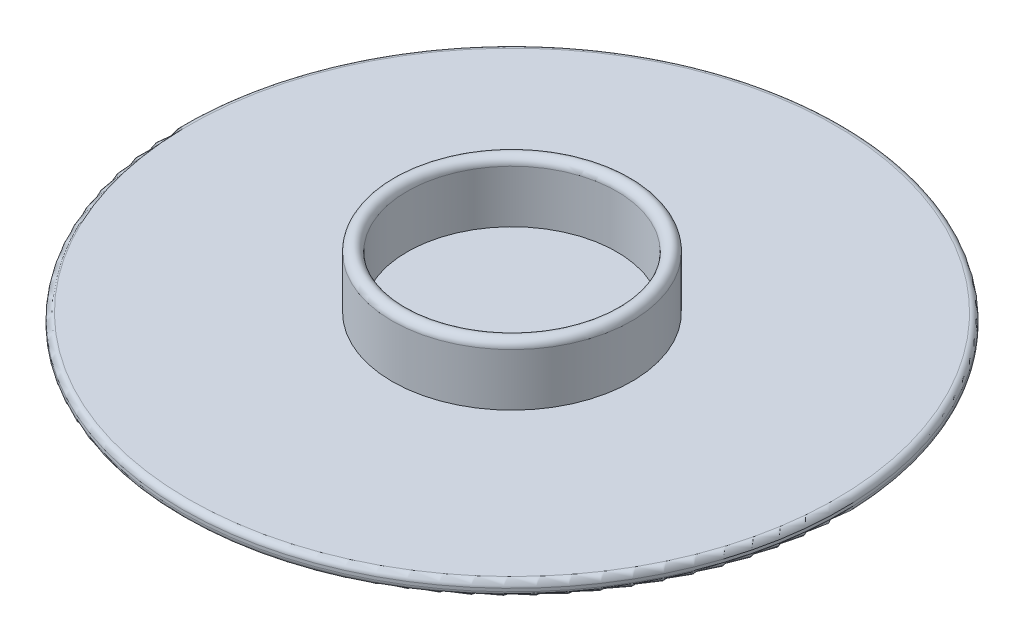
ISO-10303-21;
HEADER;
FILE_DESCRIPTION(('STEP AP214'),'2;1');
FILE_NAME('part.step','',(''),(''),'','','');
FILE_SCHEMA(('AUTOMOTIVE_DESIGN { 1 0 10303 214 1 1 1 1 }'));
ENDSEC;
DATA;
#1=APPLICATION_CONTEXT('core data for automotive mechanical design processes');
#2=APPLICATION_PROTOCOL_DEFINITION('international standard','automotive_design',2000,#1);
#3=PRODUCT_CONTEXT('',#1,'mechanical');
#4=PRODUCT('Part','Part','',(#3));
#5=PRODUCT_RELATED_PRODUCT_CATEGORY('part','',(#4));
#6=PRODUCT_DEFINITION_FORMATION('','',#4);
#7=PRODUCT_DEFINITION_CONTEXT('part definition',#1,'design');
#8=PRODUCT_DEFINITION('design','',#6,#7);
#9=PRODUCT_DEFINITION_SHAPE('','',#8);
#10=(LENGTH_UNIT() NAMED_UNIT(*) SI_UNIT(.MILLI.,.METRE.));
#11=(NAMED_UNIT(*) PLANE_ANGLE_UNIT() SI_UNIT($,.RADIAN.));
#12=(NAMED_UNIT(*) SI_UNIT($,.STERADIAN.) SOLID_ANGLE_UNIT());
#13=UNCERTAINTY_MEASURE_WITH_UNIT(LENGTH_MEASURE(1.E-05),#10,'distance_accuracy_value','');
#14=(GEOMETRIC_REPRESENTATION_CONTEXT(3) GLOBAL_UNCERTAINTY_ASSIGNED_CONTEXT((#13)) GLOBAL_UNIT_ASSIGNED_CONTEXT((#10,
#11,#12)) REPRESENTATION_CONTEXT('',''));
#15=CARTESIAN_POINT('',(0.,0.,0.));
#16=DIRECTION('',(0.,0.,1.));
#17=DIRECTION('',(1.,0.,0.));
#18=AXIS2_PLACEMENT_3D('',#15,#16,#17);
#19=CARTESIAN_POINT('',(0.,2.25,0.));
#20=DIRECTION('',(0.,1.,0.));
#21=DIRECTION('',(0.,0.,1.));
#22=AXIS2_PLACEMENT_3D('',#19,#20,#21);
#23=TOROIDAL_SURFACE('',#22,3.75,0.25);
#24=CARTESIAN_POINT('',(0.,2.25,0.));
#25=DIRECTION('',(0.,1.,0.));
#26=DIRECTION('',(0.,0.,1.));
#27=AXIS2_PLACEMENT_3D('',#24,#25,#26);
#28=CIRCLE('',#27,4.);
#29=CARTESIAN_POINT('',(0.,2.25,4.));
#30=VERTEX_POINT('',#29);
#31=EDGE_CURVE('E60',#30,#30,#28,.F.);
#32=ORIENTED_EDGE('',*,*,#31,.F.);
#33=EDGE_LOOP('',(#32));
#34=FACE_BOUND('',#33,.T.);
#35=CARTESIAN_POINT('',(0.,2.25,0.));
#36=DIRECTION('',(0.,1.,0.));
#37=DIRECTION('',(0.,0.,1.));
#38=AXIS2_PLACEMENT_3D('',#35,#36,#37);
#39=CIRCLE('',#38,3.5);
#40=CARTESIAN_POINT('',(0.,2.25,3.5));
#41=VERTEX_POINT('',#40);
#42=EDGE_CURVE('E57',#41,#41,#39,.T.);
#43=ORIENTED_EDGE('',*,*,#42,.F.);
#44=EDGE_LOOP('',(#43));
#45=FACE_BOUND('',#44,.T.);
#46=ADVANCED_FACE('F37',(#34,#45),#23,.T.);
#47=CARTESIAN_POINT('',(0.,0.5,0.));
#48=DIRECTION('',(0.,-1.,0.));
#49=DIRECTION('',(0.,0.,-1.));
#50=AXIS2_PLACEMENT_3D('',#47,#48,#49);
#51=CYLINDRICAL_SURFACE('',#50,11.);
#52=CARTESIAN_POINT('',(0.,0.2,0.));
#53=DIRECTION('',(0.,1.,0.));
#54=DIRECTION('',(0.,0.,1.));
#55=AXIS2_PLACEMENT_3D('',#52,#53,#54);
#56=CIRCLE('',#55,11.);
#57=CARTESIAN_POINT('',(0.,0.2,11.));
#58=VERTEX_POINT('',#57);
#59=EDGE_CURVE('E48',#58,#58,#56,.T.);
#60=ORIENTED_EDGE('',*,*,#59,.T.);
#61=EDGE_LOOP('',(#60));
#62=FACE_BOUND('',#61,.T.);
#63=CARTESIAN_POINT('',(0.,0.3,0.));
#64=DIRECTION('',(0.,1.,0.));
#65=DIRECTION('',(0.,0.,1.));
#66=AXIS2_PLACEMENT_3D('',#63,#64,#65);
#67=CIRCLE('',#66,11.);
#68=CARTESIAN_POINT('',(0.,0.3,11.));
#69=VERTEX_POINT('',#68);
#70=EDGE_CURVE('E52',#69,#69,#67,.F.);
#71=ORIENTED_EDGE('',*,*,#70,.T.);
#72=EDGE_LOOP('',(#71));
#73=FACE_BOUND('',#72,.T.);
#74=ADVANCED_FACE('F87',(#62,#73),#51,.T.);
#75=CARTESIAN_POINT('',(0.,0.5,0.));
#76=DIRECTION('',(0.,1.,0.));
#77=DIRECTION('',(0.,0.,1.));
#78=AXIS2_PLACEMENT_3D('',#75,#76,#77);
#79=PLANE('',#78);
#80=CARTESIAN_POINT('',(0.,0.5,0.));
#81=DIRECTION('',(0.,1.,0.));
#82=DIRECTION('',(0.,0.,1.));
#83=AXIS2_PLACEMENT_3D('',#80,#81,#82);
#84=CIRCLE('',#83,10.8);
#85=CARTESIAN_POINT('',(0.,0.5,10.8));
#86=VERTEX_POINT('',#85);
#87=EDGE_CURVE('E10',#86,#86,#84,.T.);
#88=ORIENTED_EDGE('',*,*,#87,.T.);
#89=EDGE_LOOP('',(#88));
#90=FACE_BOUND('',#89,.T.);
#91=CARTESIAN_POINT('',(0.,0.5,0.));
#92=DIRECTION('',(0.,1.,0.));
#93=DIRECTION('',(0.,0.,1.));
#94=AXIS2_PLACEMENT_3D('',#91,#92,#93);
#95=CIRCLE('',#94,4.);
#96=CARTESIAN_POINT('',(0.,0.5,4.));
#97=VERTEX_POINT('',#96);
#98=EDGE_CURVE('E66',#97,#97,#95,.T.);
#99=ORIENTED_EDGE('',*,*,#98,.F.);
#100=EDGE_LOOP('',(#99));
#101=FACE_BOUND('',#100,.T.);
#102=ADVANCED_FACE('F78',(#90,#101),#79,.T.);
#103=CARTESIAN_POINT('',(0.,0.,0.));
#104=DIRECTION('',(0.,1.,0.));
#105=DIRECTION('',(0.,0.,1.));
#106=AXIS2_PLACEMENT_3D('',#103,#104,#105);
#107=PLANE('',#106);
#108=CARTESIAN_POINT('',(0.,0.,0.));
#109=DIRECTION('',(0.,1.,0.));
#110=DIRECTION('',(0.,0.,1.));
#111=AXIS2_PLACEMENT_3D('',#108,#109,#110);
#112=CIRCLE('',#111,10.8);
#113=CARTESIAN_POINT('',(0.,0.,10.8));
#114=VERTEX_POINT('',#113);
#115=EDGE_CURVE('E44',#114,#114,#112,.F.);
#116=ORIENTED_EDGE('',*,*,#115,.T.);
#117=EDGE_LOOP('',(#116));
#118=FACE_BOUND('',#117,.T.);
#119=CARTESIAN_POINT('',(0.,0.,0.));
#120=DIRECTION('',(0.,-1.,0.));
#121=DIRECTION('',(0.,0.,-1.));
#122=AXIS2_PLACEMENT_3D('',#119,#120,#121);
#123=CIRCLE('',#122,8.);
#124=CARTESIAN_POINT('',(0.,0.,-8.));
#125=VERTEX_POINT('',#124);
#126=EDGE_CURVE('E69',#125,#125,#123,.T.);
#127=ORIENTED_EDGE('',*,*,#126,.F.);
#128=EDGE_LOOP('',(#127));
#129=FACE_BOUND('',#128,.T.);
#130=ADVANCED_FACE('F75',(#118,#129),#107,.F.);
#131=CARTESIAN_POINT('',(0.,2.5,0.));
#132=DIRECTION('',(0.,-1.,0.));
#133=DIRECTION('',(0.,0.,-1.));
#134=AXIS2_PLACEMENT_3D('',#131,#132,#133);
#135=CYLINDRICAL_SURFACE('',#134,4.);
#136=ORIENTED_EDGE('',*,*,#31,.T.);
#137=EDGE_LOOP('',(#136));
#138=FACE_BOUND('',#137,.T.);
#139=ORIENTED_EDGE('',*,*,#98,.T.);
#140=EDGE_LOOP('',(#139));
#141=FACE_BOUND('',#140,.T.);
#142=ADVANCED_FACE('F77',(#138,#141),#135,.T.);
#143=CARTESIAN_POINT('',(0.,2.5,0.));
#144=DIRECTION('',(0.,-1.,0.));
#145=DIRECTION('',(0.,0.,-1.));
#146=AXIS2_PLACEMENT_3D('',#143,#144,#145);
#147=CYLINDRICAL_SURFACE('',#146,3.5);
#148=ORIENTED_EDGE('',*,*,#42,.T.);
#149=EDGE_LOOP('',(#148));
#150=FACE_BOUND('',#149,.T.);
#151=CARTESIAN_POINT('',(0.,0.5,0.));
#152=DIRECTION('',(0.,1.,0.));
#153=DIRECTION('',(0.,0.,1.));
#154=AXIS2_PLACEMENT_3D('',#151,#152,#153);
#155=CIRCLE('',#154,3.5);
#156=CARTESIAN_POINT('',(0.,0.5,3.5));
#157=VERTEX_POINT('',#156);
#158=EDGE_CURVE('E63',#157,#157,#155,.F.);
#159=ORIENTED_EDGE('',*,*,#158,.T.);
#160=EDGE_LOOP('',(#159));
#161=FACE_BOUND('',#160,.T.);
#162=ADVANCED_FACE('F84',(#150,#161),#147,.F.);
#163=ORIENTED_EDGE('',*,*,#158,.F.);
#164=EDGE_LOOP('',(#163));
#165=FACE_BOUND('',#164,.T.);
#166=ADVANCED_FACE('F89',(#165),#79,.T.);
#167=CARTESIAN_POINT('',(0.,-106.516666666663,0.));
#168=DIRECTION('',(0.,-1.,0.));
#169=DIRECTION('',(0.,0.,-1.));
#170=AXIS2_PLACEMENT_3D('',#167,#168,#169);
#171=SPHERICAL_SURFACE('',#170,106.816666666663);
#172=ORIENTED_EDGE('',*,*,#126,.T.);
#173=EDGE_LOOP('',(#172));
#174=FACE_BOUND('',#173,.T.);
#175=ADVANCED_FACE('F73',(#174),#171,.F.);
#176=CARTESIAN_POINT('',(0.,0.2,0.));
#177=DIRECTION('',(0.,1.,0.));
#178=DIRECTION('',(0.,0.,1.));
#179=AXIS2_PLACEMENT_3D('',#176,#177,#178);
#180=TOROIDAL_SURFACE('',#179,10.8,0.2);
#181=ORIENTED_EDGE('',*,*,#115,.F.);
#182=EDGE_LOOP('',(#181));
#183=FACE_BOUND('',#182,.T.);
#184=ORIENTED_EDGE('',*,*,#59,.F.);
#185=EDGE_LOOP('',(#184));
#186=FACE_BOUND('',#185,.T.);
#187=ADVANCED_FACE('F103',(#183,#186),#180,.T.);
#188=CARTESIAN_POINT('',(0.,0.3,0.));
#189=DIRECTION('',(0.,1.,0.));
#190=DIRECTION('',(0.,0.,1.));
#191=AXIS2_PLACEMENT_3D('',#188,#189,#190);
#192=TOROIDAL_SURFACE('',#191,10.8,0.2);
#193=ORIENTED_EDGE('',*,*,#70,.F.);
#194=EDGE_LOOP('',(#193));
#195=FACE_BOUND('',#194,.T.);
#196=ORIENTED_EDGE('',*,*,#87,.F.);
#197=EDGE_LOOP('',(#196));
#198=FACE_BOUND('',#197,.T.);
#199=ADVANCED_FACE('F39',(#195,#198),#192,.T.);
#200=CLOSED_SHELL('',(#46,#74,#102,#130,#142,#162,#166,#175,#187,#199));
#201=MANIFOLD_SOLID_BREP('B2',#200);
#202=ADVANCED_BREP_SHAPE_REPRESENTATION('',(#18,#201),#14);
#203=SHAPE_DEFINITION_REPRESENTATION(#9,#202);
ENDSEC;
END-ISO-10303-21;
